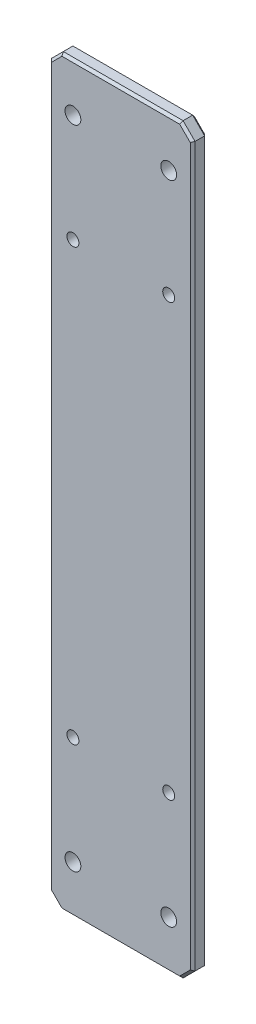
ISO-10303-21;
HEADER;
FILE_DESCRIPTION(('STEP AP214'),'2;1');
FILE_NAME('part.step','',(''),(''),'','','');
FILE_SCHEMA(('AUTOMOTIVE_DESIGN { 1 0 10303 214 1 1 1 1 }'));
ENDSEC;
DATA;
#1=APPLICATION_CONTEXT('core data for automotive mechanical design processes');
#2=APPLICATION_PROTOCOL_DEFINITION('international standard','automotive_design',2000,#1);
#3=PRODUCT_CONTEXT('',#1,'mechanical');
#4=PRODUCT('Part','Part','',(#3));
#5=PRODUCT_RELATED_PRODUCT_CATEGORY('part','',(#4));
#6=PRODUCT_DEFINITION_FORMATION('','',#4);
#7=PRODUCT_DEFINITION_CONTEXT('part definition',#1,'design');
#8=PRODUCT_DEFINITION('design','',#6,#7);
#9=PRODUCT_DEFINITION_SHAPE('','',#8);
#10=(LENGTH_UNIT() NAMED_UNIT(*) SI_UNIT(.MILLI.,.METRE.));
#11=(NAMED_UNIT(*) PLANE_ANGLE_UNIT() SI_UNIT($,.RADIAN.));
#12=(NAMED_UNIT(*) SI_UNIT($,.STERADIAN.) SOLID_ANGLE_UNIT());
#13=UNCERTAINTY_MEASURE_WITH_UNIT(LENGTH_MEASURE(1.E-05),#10,'distance_accuracy_value','');
#14=(GEOMETRIC_REPRESENTATION_CONTEXT(3) GLOBAL_UNCERTAINTY_ASSIGNED_CONTEXT((#13)) GLOBAL_UNIT_ASSIGNED_CONTEXT((#10,
#11,#12)) REPRESENTATION_CONTEXT('',''));
#15=CARTESIAN_POINT('',(0.,0.,0.));
#16=DIRECTION('',(0.,0.,1.));
#17=DIRECTION('',(1.,0.,0.));
#18=AXIS2_PLACEMENT_3D('',#15,#16,#17);
#19=CARTESIAN_POINT('',(30.,155.,6.));
#20=DIRECTION('',(-1.,0.,0.));
#21=DIRECTION('',(0.,-1.,0.));
#22=AXIS2_PLACEMENT_3D('',#19,#20,#21);
#23=PLANE('',#22);
#24=DIRECTION('',(0.,0.,1.));
#25=VECTOR('',#24,1.);
#26=CARTESIAN_POINT('',(30.,150.,6.));
#27=LINE('',#26,#25);
#28=CARTESIAN_POINT('',(30.,150.,1.));
#29=VERTEX_POINT('',#28);
#30=CARTESIAN_POINT('',(30.,150.,5.));
#31=VERTEX_POINT('',#30);
#32=EDGE_CURVE('E368',#29,#31,#27,.T.);
#33=ORIENTED_EDGE('',*,*,#32,.T.);
#34=DIRECTION('',(0.,-1.,0.));
#35=VECTOR('',#34,1.);
#36=CARTESIAN_POINT('',(30.,-150.,5.));
#37=LINE('',#36,#35);
#38=CARTESIAN_POINT('',(30.,-150.,5.));
#39=VERTEX_POINT('',#38);
#40=EDGE_CURVE('E262',#31,#39,#37,.T.);
#41=ORIENTED_EDGE('',*,*,#40,.T.);
#42=DIRECTION('',(0.,0.,-1.));
#43=VECTOR('',#42,1.);
#44=CARTESIAN_POINT('',(30.,-150.,6.));
#45=LINE('',#44,#43);
#46=CARTESIAN_POINT('',(30.,-150.,1.));
#47=VERTEX_POINT('',#46);
#48=EDGE_CURVE('E378',#39,#47,#45,.T.);
#49=ORIENTED_EDGE('',*,*,#48,.T.);
#50=DIRECTION('',(0.,1.,0.));
#51=VECTOR('',#50,1.);
#52=CARTESIAN_POINT('',(30.,155.,1.));
#53=LINE('',#52,#51);
#54=EDGE_CURVE('E259',#47,#29,#53,.T.);
#55=ORIENTED_EDGE('',*,*,#54,.T.);
#56=EDGE_LOOP('',(#33,#41,#49,#55));
#57=FACE_BOUND('',#56,.T.);
#58=ADVANCED_FACE('F44',(#57),#23,.F.);
#59=CARTESIAN_POINT('',(-30.,155.,6.));
#60=DIRECTION('',(0.,-1.,0.));
#61=DIRECTION('',(0.,0.,-1.));
#62=AXIS2_PLACEMENT_3D('',#59,#60,#61);
#63=PLANE('',#62);
#64=DIRECTION('',(0.,0.,1.));
#65=VECTOR('',#64,1.);
#66=CARTESIAN_POINT('',(-25.,155.,6.));
#67=LINE('',#66,#65);
#68=CARTESIAN_POINT('',(-25.,155.,1.));
#69=VERTEX_POINT('',#68);
#70=CARTESIAN_POINT('',(-25.,155.,4.99999999999999));
#71=VERTEX_POINT('',#70);
#72=EDGE_CURVE('E190',#69,#71,#67,.T.);
#73=ORIENTED_EDGE('',*,*,#72,.T.);
#74=DIRECTION('',(1.,0.,0.));
#75=VECTOR('',#74,1.);
#76=CARTESIAN_POINT('',(25.,155.,5.));
#77=LINE('',#76,#75);
#78=CARTESIAN_POINT('',(25.,155.,5.));
#79=VERTEX_POINT('',#78);
#80=EDGE_CURVE('E226',#71,#79,#77,.T.);
#81=ORIENTED_EDGE('',*,*,#80,.T.);
#82=DIRECTION('',(0.,0.,-1.));
#83=VECTOR('',#82,1.);
#84=CARTESIAN_POINT('',(25.,155.,6.));
#85=LINE('',#84,#83);
#86=CARTESIAN_POINT('',(25.,155.,1.00000000000001));
#87=VERTEX_POINT('',#86);
#88=EDGE_CURVE('E195',#79,#87,#85,.T.);
#89=ORIENTED_EDGE('',*,*,#88,.T.);
#90=DIRECTION('',(-1.,0.,0.));
#91=VECTOR('',#90,1.);
#92=CARTESIAN_POINT('',(-30.,155.,1.));
#93=LINE('',#92,#91);
#94=EDGE_CURVE('E223',#87,#69,#93,.T.);
#95=ORIENTED_EDGE('',*,*,#94,.T.);
#96=EDGE_LOOP('',(#73,#81,#89,#95));
#97=FACE_BOUND('',#96,.T.);
#98=ADVANCED_FACE('F386',(#97),#63,.F.);
#99=CARTESIAN_POINT('',(-30.,155.,6.));
#100=DIRECTION('',(1.,0.,0.));
#101=DIRECTION('',(0.,1.,0.));
#102=AXIS2_PLACEMENT_3D('',#99,#100,#101);
#103=PLANE('',#102);
#104=DIRECTION('',(0.,0.,1.));
#105=VECTOR('',#104,1.);
#106=CARTESIAN_POINT('',(-30.,-150.,6.));
#107=LINE('',#106,#105);
#108=CARTESIAN_POINT('',(-30.,-150.,1.));
#109=VERTEX_POINT('',#108);
#110=CARTESIAN_POINT('',(-30.,-150.,5.00000000000001));
#111=VERTEX_POINT('',#110);
#112=EDGE_CURVE('E362',#109,#111,#107,.T.);
#113=ORIENTED_EDGE('',*,*,#112,.T.);
#114=DIRECTION('',(0.,1.,0.));
#115=VECTOR('',#114,1.);
#116=CARTESIAN_POINT('',(-30.,150.,5.));
#117=LINE('',#116,#115);
#118=CARTESIAN_POINT('',(-30.,150.,5.));
#119=VERTEX_POINT('',#118);
#120=EDGE_CURVE('E238',#111,#119,#117,.T.);
#121=ORIENTED_EDGE('',*,*,#120,.T.);
#122=DIRECTION('',(0.,0.,-1.));
#123=VECTOR('',#122,1.);
#124=CARTESIAN_POINT('',(-30.,150.,6.));
#125=LINE('',#124,#123);
#126=CARTESIAN_POINT('',(-30.,150.,1.));
#127=VERTEX_POINT('',#126);
#128=EDGE_CURVE('E354',#119,#127,#125,.T.);
#129=ORIENTED_EDGE('',*,*,#128,.T.);
#130=DIRECTION('',(0.,-1.,0.));
#131=VECTOR('',#130,1.);
#132=CARTESIAN_POINT('',(-30.,155.,1.));
#133=LINE('',#132,#131);
#134=EDGE_CURVE('E235',#127,#109,#133,.T.);
#135=ORIENTED_EDGE('',*,*,#134,.T.);
#136=EDGE_LOOP('',(#113,#121,#129,#135));
#137=FACE_BOUND('',#136,.T.);
#138=ADVANCED_FACE('F358',(#137),#103,.F.);
#139=CARTESIAN_POINT('',(-30.,-155.,6.));
#140=DIRECTION('',(0.,1.,0.));
#141=DIRECTION('',(0.,0.,1.));
#142=AXIS2_PLACEMENT_3D('',#139,#140,#141);
#143=PLANE('',#142);
#144=DIRECTION('',(0.,0.,1.));
#145=VECTOR('',#144,1.);
#146=CARTESIAN_POINT('',(25.,-155.,6.));
#147=LINE('',#146,#145);
#148=CARTESIAN_POINT('',(25.,-155.,1.));
#149=VERTEX_POINT('',#148);
#150=CARTESIAN_POINT('',(25.,-155.,5.));
#151=VERTEX_POINT('',#150);
#152=EDGE_CURVE('E371',#149,#151,#147,.T.);
#153=ORIENTED_EDGE('',*,*,#152,.T.);
#154=DIRECTION('',(-1.,0.,0.));
#155=VECTOR('',#154,1.);
#156=CARTESIAN_POINT('',(-25.,-155.,5.));
#157=LINE('',#156,#155);
#158=CARTESIAN_POINT('',(-25.,-155.,5.));
#159=VERTEX_POINT('',#158);
#160=EDGE_CURVE('E250',#151,#159,#157,.T.);
#161=ORIENTED_EDGE('',*,*,#160,.T.);
#162=DIRECTION('',(0.,0.,-1.));
#163=VECTOR('',#162,1.);
#164=CARTESIAN_POINT('',(-25.,-155.,6.));
#165=LINE('',#164,#163);
#166=CARTESIAN_POINT('',(-25.,-155.,0.999999999999997));
#167=VERTEX_POINT('',#166);
#168=EDGE_CURVE('E363',#159,#167,#165,.T.);
#169=ORIENTED_EDGE('',*,*,#168,.T.);
#170=DIRECTION('',(1.,0.,0.));
#171=VECTOR('',#170,1.);
#172=CARTESIAN_POINT('',(-30.,-155.,1.));
#173=LINE('',#172,#171);
#174=EDGE_CURVE('E247',#167,#149,#173,.T.);
#175=ORIENTED_EDGE('',*,*,#174,.T.);
#176=EDGE_LOOP('',(#153,#161,#169,#175));
#177=FACE_BOUND('',#176,.T.);
#178=ADVANCED_FACE('F419',(#177),#143,.F.);
#179=CARTESIAN_POINT('',(0.,0.,6.));
#180=DIRECTION('',(0.,0.,1.));
#181=DIRECTION('',(1.,0.,0.));
#182=AXIS2_PLACEMENT_3D('',#179,#180,#181);
#183=PLANE('',#182);
#184=CARTESIAN_POINT('',(20.,89.9999998886689,6.));
#185=DIRECTION('',(0.,0.,1.));
#186=DIRECTION('',(1.,0.,0.));
#187=AXIS2_PLACEMENT_3D('',#184,#185,#186);
#188=CIRCLE('',#187,2.5);
#189=CARTESIAN_POINT('',(22.5,89.9999998886689,6.));
#190=VERTEX_POINT('',#189);
#191=EDGE_CURVE('E887',#190,#190,#188,.T.);
#192=ORIENTED_EDGE('',*,*,#191,.F.);
#193=EDGE_LOOP('',(#192));
#194=FACE_BOUND('',#193,.T.);
#195=CARTESIAN_POINT('',(-20.,89.9999998886689,6.));
#196=DIRECTION('',(0.,0.,1.));
#197=DIRECTION('',(1.,0.,0.));
#198=AXIS2_PLACEMENT_3D('',#195,#196,#197);
#199=CIRCLE('',#198,2.5);
#200=CARTESIAN_POINT('',(-17.5,89.9999998886689,6.));
#201=VERTEX_POINT('',#200);
#202=EDGE_CURVE('E891',#201,#201,#199,.T.);
#203=ORIENTED_EDGE('',*,*,#202,.F.);
#204=EDGE_LOOP('',(#203));
#205=FACE_BOUND('',#204,.T.);
#206=CARTESIAN_POINT('',(-20.,-90.0000001113311,6.));
#207=DIRECTION('',(0.,0.,1.));
#208=DIRECTION('',(1.,0.,0.));
#209=AXIS2_PLACEMENT_3D('',#206,#207,#208);
#210=CIRCLE('',#209,2.5);
#211=CARTESIAN_POINT('',(-17.5,-90.0000001113311,6.));
#212=VERTEX_POINT('',#211);
#213=EDGE_CURVE('E895',#212,#212,#210,.T.);
#214=ORIENTED_EDGE('',*,*,#213,.F.);
#215=EDGE_LOOP('',(#214));
#216=FACE_BOUND('',#215,.T.);
#217=CARTESIAN_POINT('',(20.,-90.0000001113311,6.));
#218=DIRECTION('',(0.,0.,1.));
#219=DIRECTION('',(1.,0.,0.));
#220=AXIS2_PLACEMENT_3D('',#217,#218,#219);
#221=CIRCLE('',#220,2.5);
#222=CARTESIAN_POINT('',(22.5,-90.0000001113311,6.));
#223=VERTEX_POINT('',#222);
#224=EDGE_CURVE('E311',#223,#223,#221,.T.);
#225=ORIENTED_EDGE('',*,*,#224,.F.);
#226=EDGE_LOOP('',(#225));
#227=FACE_BOUND('',#226,.T.);
#228=DIRECTION('',(0.,1.,0.));
#229=VECTOR('',#228,1.);
#230=CARTESIAN_POINT('',(29.,150.,6.));
#231=LINE('',#230,#229);
#232=CARTESIAN_POINT('',(29.,-149.585786437627,6.));
#233=VERTEX_POINT('',#232);
#234=CARTESIAN_POINT('',(29.,149.585786437627,6.));
#235=VERTEX_POINT('',#234);
#236=EDGE_CURVE('E166',#233,#235,#231,.T.);
#237=ORIENTED_EDGE('',*,*,#236,.T.);
#238=DIRECTION('',(-0.707106781186546,0.707106781186549,0.));
#239=VECTOR('',#238,1.);
#240=CARTESIAN_POINT('',(89.2928932188135,89.292893218813,6.));
#241=LINE('',#240,#239);
#242=CARTESIAN_POINT('',(24.5857864376269,154.,6.));
#243=VERTEX_POINT('',#242);
#244=EDGE_CURVE('E213',#235,#243,#241,.T.);
#245=ORIENTED_EDGE('',*,*,#244,.T.);
#246=DIRECTION('',(-1.,0.,0.));
#247=VECTOR('',#246,1.);
#248=CARTESIAN_POINT('',(-25.,154.,6.));
#249=LINE('',#248,#247);
#250=CARTESIAN_POINT('',(-24.5857864376269,154.,6.));
#251=VERTEX_POINT('',#250);
#252=EDGE_CURVE('E210',#243,#251,#249,.T.);
#253=ORIENTED_EDGE('',*,*,#252,.T.);
#254=DIRECTION('',(-0.707106781186551,-0.707106781186544,0.));
#255=VECTOR('',#254,1.);
#256=CARTESIAN_POINT('',(-89.2928932188133,89.2928932188143,6.));
#257=LINE('',#256,#255);
#258=CARTESIAN_POINT('',(-29.,149.585786437627,6.));
#259=VERTEX_POINT('',#258);
#260=EDGE_CURVE('E207',#251,#259,#257,.T.);
#261=ORIENTED_EDGE('',*,*,#260,.T.);
#262=DIRECTION('',(0.,-1.,0.));
#263=VECTOR('',#262,1.);
#264=CARTESIAN_POINT('',(-29.,-150.,6.));
#265=LINE('',#264,#263);
#266=CARTESIAN_POINT('',(-29.,-149.585786437627,6.));
#267=VERTEX_POINT('',#266);
#268=EDGE_CURVE('E204',#259,#267,#265,.T.);
#269=ORIENTED_EDGE('',*,*,#268,.T.);
#270=DIRECTION('',(0.707106781186544,-0.707106781186551,0.));
#271=VECTOR('',#270,1.);
#272=CARTESIAN_POINT('',(-89.2928932188136,-89.2928932188126,6.));
#273=LINE('',#272,#271);
#274=CARTESIAN_POINT('',(-24.5857864376269,-154.,6.));
#275=VERTEX_POINT('',#274);
#276=EDGE_CURVE('E201',#267,#275,#273,.T.);
#277=ORIENTED_EDGE('',*,*,#276,.T.);
#278=DIRECTION('',(1.,0.,0.));
#279=VECTOR('',#278,1.);
#280=CARTESIAN_POINT('',(25.,-154.,6.));
#281=LINE('',#280,#279);
#282=CARTESIAN_POINT('',(24.5857864376269,-154.,6.));
#283=VERTEX_POINT('',#282);
#284=EDGE_CURVE('E169',#275,#283,#281,.T.);
#285=ORIENTED_EDGE('',*,*,#284,.T.);
#286=DIRECTION('',(0.707106781186552,0.707106781186543,0.));
#287=VECTOR('',#286,1.);
#288=CARTESIAN_POINT('',(89.2928932188133,-89.2928932188144,6.));
#289=LINE('',#288,#287);
#290=EDGE_CURVE('E160',#283,#233,#289,.T.);
#291=ORIENTED_EDGE('',*,*,#290,.T.);
#292=EDGE_LOOP('',(#237,#245,#253,#261,#269,#277,#285,#291));
#293=FACE_BOUND('',#292,.T.);
#294=CARTESIAN_POINT('',(20.,135.,6.));
#295=DIRECTION('',(0.,0.,1.));
#296=DIRECTION('',(1.,0.,0.));
#297=AXIS2_PLACEMENT_3D('',#294,#295,#296);
#298=CIRCLE('',#297,3.3);
#299=CARTESIAN_POINT('',(23.3,135.,6.));
#300=VERTEX_POINT('',#299);
#301=EDGE_CURVE('E920',#300,#300,#298,.T.);
#302=ORIENTED_EDGE('',*,*,#301,.F.);
#303=EDGE_LOOP('',(#302));
#304=FACE_BOUND('',#303,.T.);
#305=CARTESIAN_POINT('',(-20.,-135.,6.));
#306=DIRECTION('',(0.,0.,1.));
#307=DIRECTION('',(1.,0.,0.));
#308=AXIS2_PLACEMENT_3D('',#305,#306,#307);
#309=CIRCLE('',#308,3.3);
#310=CARTESIAN_POINT('',(-16.7,-135.,6.));
#311=VERTEX_POINT('',#310);
#312=EDGE_CURVE('E911',#311,#311,#309,.T.);
#313=ORIENTED_EDGE('',*,*,#312,.F.);
#314=EDGE_LOOP('',(#313));
#315=FACE_BOUND('',#314,.T.);
#316=CARTESIAN_POINT('',(20.,-135.,6.));
#317=DIRECTION('',(0.,0.,1.));
#318=DIRECTION('',(1.,0.,0.));
#319=AXIS2_PLACEMENT_3D('',#316,#317,#318);
#320=CIRCLE('',#319,3.3);
#321=CARTESIAN_POINT('',(23.3,-135.,6.));
#322=VERTEX_POINT('',#321);
#323=EDGE_CURVE('E307',#322,#322,#320,.T.);
#324=ORIENTED_EDGE('',*,*,#323,.F.);
#325=EDGE_LOOP('',(#324));
#326=FACE_BOUND('',#325,.T.);
#327=CARTESIAN_POINT('',(-20.,135.,6.));
#328=DIRECTION('',(0.,0.,1.));
#329=DIRECTION('',(1.,0.,0.));
#330=AXIS2_PLACEMENT_3D('',#327,#328,#329);
#331=CIRCLE('',#330,3.3);
#332=CARTESIAN_POINT('',(-16.7,135.,6.));
#333=VERTEX_POINT('',#332);
#334=EDGE_CURVE('E919',#333,#333,#331,.T.);
#335=ORIENTED_EDGE('',*,*,#334,.F.);
#336=EDGE_LOOP('',(#335));
#337=FACE_BOUND('',#336,.T.);
#338=ADVANCED_FACE('F162',(#194,#205,#216,#227,#293,#304,#315,#326,#337),#183,.T.);
#339=CARTESIAN_POINT('',(0.,0.,0.));
#340=DIRECTION('',(0.,0.,1.));
#341=DIRECTION('',(1.,0.,0.));
#342=AXIS2_PLACEMENT_3D('',#339,#340,#341);
#343=PLANE('',#342);
#344=CARTESIAN_POINT('',(20.,89.9999998886689,0.));
#345=DIRECTION('',(0.,0.,-1.));
#346=DIRECTION('',(-1.,0.,0.));
#347=AXIS2_PLACEMENT_3D('',#344,#345,#346);
#348=CIRCLE('',#347,2.5);
#349=CARTESIAN_POINT('',(17.5,89.9999998886689,0.));
#350=VERTEX_POINT('',#349);
#351=EDGE_CURVE('E986',#350,#350,#348,.T.);
#352=ORIENTED_EDGE('',*,*,#351,.F.);
#353=EDGE_LOOP('',(#352));
#354=FACE_BOUND('',#353,.T.);
#355=CARTESIAN_POINT('',(-20.,89.9999998886689,0.));
#356=DIRECTION('',(0.,0.,-1.));
#357=DIRECTION('',(-1.,0.,0.));
#358=AXIS2_PLACEMENT_3D('',#355,#356,#357);
#359=CIRCLE('',#358,2.5);
#360=CARTESIAN_POINT('',(-22.5,89.9999998886689,0.));
#361=VERTEX_POINT('',#360);
#362=EDGE_CURVE('E980',#361,#361,#359,.T.);
#363=ORIENTED_EDGE('',*,*,#362,.F.);
#364=EDGE_LOOP('',(#363));
#365=FACE_BOUND('',#364,.T.);
#366=CARTESIAN_POINT('',(-20.,-90.0000001113311,0.));
#367=DIRECTION('',(0.,0.,-1.));
#368=DIRECTION('',(-1.,0.,0.));
#369=AXIS2_PLACEMENT_3D('',#366,#367,#368);
#370=CIRCLE('',#369,2.5);
#371=CARTESIAN_POINT('',(-22.5,-90.0000001113311,0.));
#372=VERTEX_POINT('',#371);
#373=EDGE_CURVE('E974',#372,#372,#370,.T.);
#374=ORIENTED_EDGE('',*,*,#373,.F.);
#375=EDGE_LOOP('',(#374));
#376=FACE_BOUND('',#375,.T.);
#377=CARTESIAN_POINT('',(20.,-90.0000001113311,0.));
#378=DIRECTION('',(0.,0.,-1.));
#379=DIRECTION('',(-1.,0.,0.));
#380=AXIS2_PLACEMENT_3D('',#377,#378,#379);
#381=CIRCLE('',#380,2.5);
#382=CARTESIAN_POINT('',(17.5,-90.0000001113311,0.));
#383=VERTEX_POINT('',#382);
#384=EDGE_CURVE('E899',#383,#383,#381,.T.);
#385=ORIENTED_EDGE('',*,*,#384,.F.);
#386=EDGE_LOOP('',(#385));
#387=FACE_BOUND('',#386,.T.);
#388=DIRECTION('',(0.,-1.,0.));
#389=VECTOR('',#388,1.);
#390=CARTESIAN_POINT('',(29.,0.,0.));
#391=LINE('',#390,#389);
#392=CARTESIAN_POINT('',(29.,149.585786437627,0.));
#393=VERTEX_POINT('',#392);
#394=CARTESIAN_POINT('',(29.,-149.585786437627,0.));
#395=VERTEX_POINT('',#394);
#396=EDGE_CURVE('E265',#393,#395,#391,.T.);
#397=ORIENTED_EDGE('',*,*,#396,.T.);
#398=DIRECTION('',(-0.707106781186552,-0.707106781186543,0.));
#399=VECTOR('',#398,1.);
#400=CARTESIAN_POINT('',(24.2928932188135,-154.292893218813,0.));
#401=LINE('',#400,#399);
#402=CARTESIAN_POINT('',(24.5857864376269,-154.,0.));
#403=VERTEX_POINT('',#402);
#404=EDGE_CURVE('E11',#395,#403,#401,.T.);
#405=ORIENTED_EDGE('',*,*,#404,.T.);
#406=DIRECTION('',(-1.,0.,0.));
#407=VECTOR('',#406,1.);
#408=CARTESIAN_POINT('',(0.,-154.,0.));
#409=LINE('',#408,#407);
#410=CARTESIAN_POINT('',(-24.5857864376269,-154.,0.));
#411=VERTEX_POINT('',#410);
#412=EDGE_CURVE('E55',#403,#411,#409,.T.);
#413=ORIENTED_EDGE('',*,*,#412,.T.);
#414=DIRECTION('',(-0.707106781186544,0.707106781186551,0.));
#415=VECTOR('',#414,1.);
#416=CARTESIAN_POINT('',(-29.2928932188134,-149.292893218813,0.));
#417=LINE('',#416,#415);
#418=CARTESIAN_POINT('',(-29.,-149.585786437627,0.));
#419=VERTEX_POINT('',#418);
#420=EDGE_CURVE('E280',#411,#419,#417,.T.);
#421=ORIENTED_EDGE('',*,*,#420,.T.);
#422=DIRECTION('',(0.,1.,0.));
#423=VECTOR('',#422,1.);
#424=CARTESIAN_POINT('',(-29.,0.,0.));
#425=LINE('',#424,#423);
#426=CARTESIAN_POINT('',(-29.,149.585786437627,0.));
#427=VERTEX_POINT('',#426);
#428=EDGE_CURVE('E277',#419,#427,#425,.T.);
#429=ORIENTED_EDGE('',*,*,#428,.T.);
#430=DIRECTION('',(0.707106781186551,0.707106781186544,0.));
#431=VECTOR('',#430,1.);
#432=CARTESIAN_POINT('',(-24.2928932188135,154.292893218813,0.));
#433=LINE('',#432,#431);
#434=CARTESIAN_POINT('',(-24.5857864376269,154.,0.));
#435=VERTEX_POINT('',#434);
#436=EDGE_CURVE('E274',#427,#435,#433,.T.);
#437=ORIENTED_EDGE('',*,*,#436,.T.);
#438=DIRECTION('',(1.,0.,0.));
#439=VECTOR('',#438,1.);
#440=CARTESIAN_POINT('',(0.,154.,0.));
#441=LINE('',#440,#439);
#442=CARTESIAN_POINT('',(24.5857864376269,154.,0.));
#443=VERTEX_POINT('',#442);
#444=EDGE_CURVE('E271',#435,#443,#441,.T.);
#445=ORIENTED_EDGE('',*,*,#444,.T.);
#446=DIRECTION('',(0.707106781186546,-0.707106781186549,0.));
#447=VECTOR('',#446,1.);
#448=CARTESIAN_POINT('',(29.2928932188135,149.292893218813,0.));
#449=LINE('',#448,#447);
#450=EDGE_CURVE('E268',#443,#393,#449,.T.);
#451=ORIENTED_EDGE('',*,*,#450,.T.);
#452=EDGE_LOOP('',(#397,#405,#413,#421,#429,#437,#445,#451));
#453=FACE_BOUND('',#452,.T.);
#454=CARTESIAN_POINT('',(20.,135.,0.));
#455=DIRECTION('',(0.,0.,1.));
#456=DIRECTION('',(1.,0.,0.));
#457=AXIS2_PLACEMENT_3D('',#454,#455,#456);
#458=CIRCLE('',#457,3.3);
#459=CARTESIAN_POINT('',(23.3,135.,0.));
#460=VERTEX_POINT('',#459);
#461=EDGE_CURVE('E915',#460,#460,#458,.T.);
#462=ORIENTED_EDGE('',*,*,#461,.T.);
#463=EDGE_LOOP('',(#462));
#464=FACE_BOUND('',#463,.T.);
#465=CARTESIAN_POINT('',(-20.,-135.,0.));
#466=DIRECTION('',(0.,0.,1.));
#467=DIRECTION('',(1.,0.,0.));
#468=AXIS2_PLACEMENT_3D('',#465,#466,#467);
#469=CIRCLE('',#468,3.3);
#470=CARTESIAN_POINT('',(-16.7,-135.,0.));
#471=VERTEX_POINT('',#470);
#472=EDGE_CURVE('E924',#471,#471,#469,.T.);
#473=ORIENTED_EDGE('',*,*,#472,.T.);
#474=EDGE_LOOP('',(#473));
#475=FACE_BOUND('',#474,.T.);
#476=CARTESIAN_POINT('',(20.,-135.,0.));
#477=DIRECTION('',(0.,0.,1.));
#478=DIRECTION('',(1.,0.,0.));
#479=AXIS2_PLACEMENT_3D('',#476,#477,#478);
#480=CIRCLE('',#479,3.3);
#481=CARTESIAN_POINT('',(23.3,-135.,0.));
#482=VERTEX_POINT('',#481);
#483=EDGE_CURVE('E907',#482,#482,#480,.T.);
#484=ORIENTED_EDGE('',*,*,#483,.T.);
#485=EDGE_LOOP('',(#484));
#486=FACE_BOUND('',#485,.T.);
#487=CARTESIAN_POINT('',(-20.,135.,0.));
#488=DIRECTION('',(0.,0.,1.));
#489=DIRECTION('',(1.,0.,0.));
#490=AXIS2_PLACEMENT_3D('',#487,#488,#489);
#491=CIRCLE('',#490,3.3);
#492=CARTESIAN_POINT('',(-16.7,135.,0.));
#493=VERTEX_POINT('',#492);
#494=EDGE_CURVE('E435',#493,#493,#491,.T.);
#495=ORIENTED_EDGE('',*,*,#494,.T.);
#496=EDGE_LOOP('',(#495));
#497=FACE_BOUND('',#496,.T.);
#498=ADVANCED_FACE('F447',(#354,#365,#376,#387,#453,#464,#475,#486,#497),#343,.F.);
#499=CARTESIAN_POINT('',(-20.,135.,0.));
#500=DIRECTION('',(0.,0.,1.));
#501=DIRECTION('',(1.,0.,0.));
#502=AXIS2_PLACEMENT_3D('',#499,#500,#501);
#503=CYLINDRICAL_SURFACE('',#502,3.3);
#504=ORIENTED_EDGE('',*,*,#494,.F.);
#505=EDGE_LOOP('',(#504));
#506=FACE_BOUND('',#505,.T.);
#507=ORIENTED_EDGE('',*,*,#334,.T.);
#508=EDGE_LOOP('',(#507));
#509=FACE_BOUND('',#508,.T.);
#510=ADVANCED_FACE('F635',(#506,#509),#503,.F.);
#511=CARTESIAN_POINT('',(20.,-135.,0.));
#512=DIRECTION('',(0.,0.,1.));
#513=DIRECTION('',(1.,0.,0.));
#514=AXIS2_PLACEMENT_3D('',#511,#512,#513);
#515=CYLINDRICAL_SURFACE('',#514,3.3);
#516=ORIENTED_EDGE('',*,*,#483,.F.);
#517=EDGE_LOOP('',(#516));
#518=FACE_BOUND('',#517,.T.);
#519=ORIENTED_EDGE('',*,*,#323,.T.);
#520=EDGE_LOOP('',(#519));
#521=FACE_BOUND('',#520,.T.);
#522=ADVANCED_FACE('F660',(#518,#521),#515,.F.);
#523=CARTESIAN_POINT('',(-20.,-135.,0.));
#524=DIRECTION('',(0.,0.,1.));
#525=DIRECTION('',(1.,0.,0.));
#526=AXIS2_PLACEMENT_3D('',#523,#524,#525);
#527=CYLINDRICAL_SURFACE('',#526,3.3);
#528=ORIENTED_EDGE('',*,*,#472,.F.);
#529=EDGE_LOOP('',(#528));
#530=FACE_BOUND('',#529,.T.);
#531=ORIENTED_EDGE('',*,*,#312,.T.);
#532=EDGE_LOOP('',(#531));
#533=FACE_BOUND('',#532,.T.);
#534=ADVANCED_FACE('F670',(#530,#533),#527,.F.);
#535=CARTESIAN_POINT('',(20.,135.,0.));
#536=DIRECTION('',(0.,0.,1.));
#537=DIRECTION('',(1.,0.,0.));
#538=AXIS2_PLACEMENT_3D('',#535,#536,#537);
#539=CYLINDRICAL_SURFACE('',#538,3.3);
#540=ORIENTED_EDGE('',*,*,#461,.F.);
#541=EDGE_LOOP('',(#540));
#542=FACE_BOUND('',#541,.T.);
#543=ORIENTED_EDGE('',*,*,#301,.T.);
#544=EDGE_LOOP('',(#543));
#545=FACE_BOUND('',#544,.T.);
#546=ADVANCED_FACE('F472',(#542,#545),#539,.F.);
#547=CARTESIAN_POINT('',(-25.,-155.,6.));
#548=DIRECTION('',(0.707106781186551,0.707106781186543,0.));
#549=DIRECTION('',(0.,0.,-1.));
#550=AXIS2_PLACEMENT_3D('',#547,#548,#549);
#551=PLANE('',#550);
#552=ORIENTED_EDGE('',*,*,#168,.F.);
#553=DIRECTION('',(0.707106781186544,-0.707106781186551,0.));
#554=VECTOR('',#553,1.);
#555=CARTESIAN_POINT('',(-25.,-155.,5.00000000000001));
#556=LINE('',#555,#554);
#557=EDGE_CURVE('E244',#159,#111,#556,.F.);
#558=ORIENTED_EDGE('',*,*,#557,.T.);
#559=ORIENTED_EDGE('',*,*,#112,.F.);
#560=DIRECTION('',(-0.707106781186544,0.707106781186551,0.));
#561=VECTOR('',#560,1.);
#562=CARTESIAN_POINT('',(-25.,-155.,0.999999999999997));
#563=LINE('',#562,#561);
#564=EDGE_CURVE('E241',#109,#167,#563,.F.);
#565=ORIENTED_EDGE('',*,*,#564,.T.);
#566=EDGE_LOOP('',(#552,#558,#559,#565));
#567=FACE_BOUND('',#566,.T.);
#568=ADVANCED_FACE('F423',(#567),#551,.F.);
#569=CARTESIAN_POINT('',(30.,-150.,6.));
#570=DIRECTION('',(-0.707106781186543,0.707106781186552,0.));
#571=DIRECTION('',(0.,0.,-1.));
#572=AXIS2_PLACEMENT_3D('',#569,#570,#571);
#573=PLANE('',#572);
#574=ORIENTED_EDGE('',*,*,#48,.F.);
#575=DIRECTION('',(0.707106781186552,0.707106781186543,0.));
#576=VECTOR('',#575,1.);
#577=CARTESIAN_POINT('',(30.,-150.,5.));
#578=LINE('',#577,#576);
#579=EDGE_CURVE('E179',#39,#151,#578,.F.);
#580=ORIENTED_EDGE('',*,*,#579,.T.);
#581=ORIENTED_EDGE('',*,*,#152,.F.);
#582=DIRECTION('',(-0.707106781186552,-0.707106781186543,0.));
#583=VECTOR('',#582,1.);
#584=CARTESIAN_POINT('',(30.,-150.,1.00000000000001));
#585=LINE('',#584,#583);
#586=EDGE_CURVE('E253',#149,#47,#585,.F.);
#587=ORIENTED_EDGE('',*,*,#586,.T.);
#588=EDGE_LOOP('',(#574,#580,#581,#587));
#589=FACE_BOUND('',#588,.T.);
#590=ADVANCED_FACE('F433',(#589),#573,.F.);
#591=CARTESIAN_POINT('',(-30.,150.,6.));
#592=DIRECTION('',(0.707106781186544,-0.707106781186551,0.));
#593=DIRECTION('',(0.,0.,-1.));
#594=AXIS2_PLACEMENT_3D('',#591,#592,#593);
#595=PLANE('',#594);
#596=ORIENTED_EDGE('',*,*,#128,.F.);
#597=DIRECTION('',(-0.707106781186551,-0.707106781186544,0.));
#598=VECTOR('',#597,1.);
#599=CARTESIAN_POINT('',(-30.,150.,4.99999999999999));
#600=LINE('',#599,#598);
#601=EDGE_CURVE('E232',#119,#71,#600,.F.);
#602=ORIENTED_EDGE('',*,*,#601,.T.);
#603=ORIENTED_EDGE('',*,*,#72,.F.);
#604=DIRECTION('',(0.707106781186551,0.707106781186544,0.));
#605=VECTOR('',#604,1.);
#606=CARTESIAN_POINT('',(-30.,150.,1.));
#607=LINE('',#606,#605);
#608=EDGE_CURVE('E229',#69,#127,#607,.F.);
#609=ORIENTED_EDGE('',*,*,#608,.T.);
#610=EDGE_LOOP('',(#596,#602,#603,#609));
#611=FACE_BOUND('',#610,.T.);
#612=ADVANCED_FACE('F353',(#611),#595,.F.);
#613=CARTESIAN_POINT('',(25.,155.,6.));
#614=DIRECTION('',(-0.707106781186549,-0.707106781186545,0.));
#615=DIRECTION('',(0.,0.,-1.));
#616=AXIS2_PLACEMENT_3D('',#613,#614,#615);
#617=PLANE('',#616);
#618=ORIENTED_EDGE('',*,*,#88,.F.);
#619=DIRECTION('',(-0.707106781186546,0.707106781186549,0.));
#620=VECTOR('',#619,1.);
#621=CARTESIAN_POINT('',(25.,155.,5.));
#622=LINE('',#621,#620);
#623=EDGE_CURVE('E219',#79,#31,#622,.F.);
#624=ORIENTED_EDGE('',*,*,#623,.T.);
#625=ORIENTED_EDGE('',*,*,#32,.F.);
#626=DIRECTION('',(0.707106781186546,-0.707106781186549,0.));
#627=VECTOR('',#626,1.);
#628=CARTESIAN_POINT('',(25.,155.,1.00000000000001));
#629=LINE('',#628,#627);
#630=EDGE_CURVE('E216',#29,#87,#629,.F.);
#631=ORIENTED_EDGE('',*,*,#630,.T.);
#632=EDGE_LOOP('',(#618,#624,#625,#631));
#633=FACE_BOUND('',#632,.T.);
#634=ADVANCED_FACE('F390',(#633),#617,.F.);
#635=CARTESIAN_POINT('',(-89.2928932188136,-89.2928932188126,6.));
#636=DIRECTION('',(-0.500000000000008,-0.500000000000002,0.70710678118654));
#637=DIRECTION('',(-0.707106781186544,0.707106781186551,0.));
#638=AXIS2_PLACEMENT_3D('',#635,#636,#637);
#639=PLANE('',#638);
#640=DIRECTION('',(-0.678598344545852,-0.281084637714799,-0.678598344545851));
#641=VECTOR('',#640,1.);
#642=CARTESIAN_POINT('',(-45.2641371769495,-156.322612636615,-10.2641371769494));
#643=LINE('',#642,#641);
#644=EDGE_CURVE('E299',#111,#267,#643,.F.);
#645=ORIENTED_EDGE('',*,*,#644,.F.);
#646=ORIENTED_EDGE('',*,*,#557,.F.);
#647=DIRECTION('',(-0.281084637714804,-0.67859834454585,-0.67859834454585));
#648=VECTOR('',#647,1.);
#649=CARTESIAN_POINT('',(-22.6432985213573,-149.310419327796,10.6895806722041));
#650=LINE('',#649,#648);
#651=EDGE_CURVE('E303',#275,#159,#650,.T.);
#652=ORIENTED_EDGE('',*,*,#651,.F.);
#653=ORIENTED_EDGE('',*,*,#276,.F.);
#654=EDGE_LOOP('',(#645,#646,#652,#653));
#655=FACE_BOUND('',#654,.T.);
#656=ADVANCED_FACE('F411',(#655),#639,.T.);
#657=CARTESIAN_POINT('',(0.,-154.,6.));
#658=DIRECTION('',(0.,-0.707106781186547,0.707106781186547));
#659=DIRECTION('',(-1.,0.,0.));
#660=AXIS2_PLACEMENT_3D('',#657,#658,#659);
#661=PLANE('',#660);
#662=ORIENTED_EDGE('',*,*,#651,.T.);
#663=ORIENTED_EDGE('',*,*,#160,.F.);
#664=DIRECTION('',(0.281084637714799,-0.678598344545851,-0.678598344545851));
#665=VECTOR('',#664,1.);
#666=CARTESIAN_POINT('',(17.3557381027063,-136.54511925322,23.4548807467797));
#667=LINE('',#666,#665);
#668=EDGE_CURVE('E296',#283,#151,#667,.T.);
#669=ORIENTED_EDGE('',*,*,#668,.F.);
#670=ORIENTED_EDGE('',*,*,#284,.F.);
#671=EDGE_LOOP('',(#662,#663,#669,#670));
#672=FACE_BOUND('',#671,.T.);
#673=ADVANCED_FACE('F415',(#672),#661,.T.);
#674=CARTESIAN_POINT('',(-29.,0.,6.));
#675=DIRECTION('',(-0.707106781186547,0.,0.707106781186548));
#676=DIRECTION('',(0.,1.,0.));
#677=AXIS2_PLACEMENT_3D('',#674,#675,#676);
#678=PLANE('',#677);
#679=ORIENTED_EDGE('',*,*,#644,.T.);
#680=ORIENTED_EDGE('',*,*,#268,.F.);
#681=DIRECTION('',(-0.678598344545849,0.281084637714815,-0.678598344545848));
#682=VECTOR('',#681,1.);
#683=CARTESIAN_POINT('',(-0.467473098977815,137.767226826449,34.5325269010222));
#684=LINE('',#683,#682);
#685=EDGE_CURVE('E183',#119,#259,#684,.F.);
#686=ORIENTED_EDGE('',*,*,#685,.F.);
#687=ORIENTED_EDGE('',*,*,#120,.F.);
#688=EDGE_LOOP('',(#679,#680,#686,#687));
#689=FACE_BOUND('',#688,.T.);
#690=ADVANCED_FACE('F406',(#689),#678,.T.);
#691=CARTESIAN_POINT('',(89.2928932188133,-89.2928932188144,6.));
#692=DIRECTION('',(0.500000000000002,-0.500000000000008,0.70710678118654));
#693=DIRECTION('',(-0.707106781186552,-0.707106781186543,0.));
#694=AXIS2_PLACEMENT_3D('',#691,#692,#693);
#695=PLANE('',#694);
#696=ORIENTED_EDGE('',*,*,#668,.T.);
#697=ORIENTED_EDGE('',*,*,#579,.F.);
#698=DIRECTION('',(0.67859834454585,-0.281084637714805,-0.678598344545851));
#699=VECTOR('',#698,1.);
#700=CARTESIAN_POINT('',(0.467473098978745,-137.767226826449,34.5325269010213));
#701=LINE('',#700,#699);
#702=EDGE_CURVE('E177',#233,#39,#701,.T.);
#703=ORIENTED_EDGE('',*,*,#702,.F.);
#704=ORIENTED_EDGE('',*,*,#290,.F.);
#705=EDGE_LOOP('',(#696,#697,#703,#704));
#706=FACE_BOUND('',#705,.T.);
#707=ADVANCED_FACE('F178',(#706),#695,.T.);
#708=CARTESIAN_POINT('',(-89.2928932188133,89.2928932188143,6.));
#709=DIRECTION('',(-0.499999999999999,0.500000000000005,0.707106781186545));
#710=DIRECTION('',(0.707106781186551,0.707106781186544,0.));
#711=AXIS2_PLACEMENT_3D('',#708,#709,#710);
#712=PLANE('',#711);
#713=ORIENTED_EDGE('',*,*,#685,.T.);
#714=ORIENTED_EDGE('',*,*,#260,.F.);
#715=DIRECTION('',(-0.281084637714812,0.678598344545849,-0.678598344545849));
#716=VECTOR('',#715,1.);
#717=CARTESIAN_POINT('',(-17.3557381027063,136.545119253221,23.454880746779));
#718=LINE('',#717,#716);
#719=EDGE_CURVE('E184',#71,#251,#718,.F.);
#720=ORIENTED_EDGE('',*,*,#719,.F.);
#721=ORIENTED_EDGE('',*,*,#601,.F.);
#722=EDGE_LOOP('',(#713,#714,#720,#721));
#723=FACE_BOUND('',#722,.T.);
#724=ADVANCED_FACE('F403',(#723),#712,.T.);
#725=CARTESIAN_POINT('',(29.,0.,6.));
#726=DIRECTION('',(0.707106781186548,0.,0.707106781186547));
#727=DIRECTION('',(0.,-1.,0.));
#728=AXIS2_PLACEMENT_3D('',#725,#726,#727);
#729=PLANE('',#728);
#730=ORIENTED_EDGE('',*,*,#702,.T.);
#731=ORIENTED_EDGE('',*,*,#40,.F.);
#732=DIRECTION('',(-0.678598344545851,-0.281084637714796,0.678598344545853));
#733=VECTOR('',#732,1.);
#734=CARTESIAN_POINT('',(0.467473098979598,137.76722682645,34.5325269010204));
#735=LINE('',#734,#733);
#736=EDGE_CURVE('E187',#235,#31,#735,.F.);
#737=ORIENTED_EDGE('',*,*,#736,.F.);
#738=ORIENTED_EDGE('',*,*,#236,.F.);
#739=EDGE_LOOP('',(#730,#731,#737,#738));
#740=FACE_BOUND('',#739,.T.);
#741=ADVANCED_FACE('F186',(#740),#729,.T.);
#742=CARTESIAN_POINT('',(0.,154.,6.));
#743=DIRECTION('',(0.,0.707106781186547,0.707106781186547));
#744=DIRECTION('',(1.,0.,0.));
#745=AXIS2_PLACEMENT_3D('',#742,#743,#744);
#746=PLANE('',#745);
#747=ORIENTED_EDGE('',*,*,#719,.T.);
#748=ORIENTED_EDGE('',*,*,#252,.F.);
#749=DIRECTION('',(0.281084637714797,0.678598344545852,-0.678598344545852));
#750=VECTOR('',#749,1.);
#751=CARTESIAN_POINT('',(22.6432985213574,149.310419327796,10.689580672204));
#752=LINE('',#751,#750);
#753=EDGE_CURVE('E285',#79,#243,#752,.F.);
#754=ORIENTED_EDGE('',*,*,#753,.F.);
#755=ORIENTED_EDGE('',*,*,#80,.F.);
#756=EDGE_LOOP('',(#747,#748,#754,#755));
#757=FACE_BOUND('',#756,.T.);
#758=ADVANCED_FACE('F398',(#757),#746,.T.);
#759=CARTESIAN_POINT('',(89.2928932188135,89.292893218813,6.));
#760=DIRECTION('',(0.500000000000008,0.500000000000006,0.707106781186538));
#761=DIRECTION('',(0.707106781186546,-0.707106781186549,0.));
#762=AXIS2_PLACEMENT_3D('',#759,#760,#761);
#763=PLANE('',#762);
#764=ORIENTED_EDGE('',*,*,#736,.T.);
#765=ORIENTED_EDGE('',*,*,#623,.F.);
#766=ORIENTED_EDGE('',*,*,#753,.T.);
#767=ORIENTED_EDGE('',*,*,#244,.F.);
#768=EDGE_LOOP('',(#764,#765,#766,#767));
#769=FACE_BOUND('',#768,.T.);
#770=ADVANCED_FACE('F395',(#769),#763,.T.);
#771=CARTESIAN_POINT('',(-89.2928932188133,89.2928932188143,0.));
#772=DIRECTION('',(0.499999999999999,-0.500000000000005,0.707106781186545));
#773=DIRECTION('',(0.707106781186551,0.707106781186544,0.));
#774=AXIS2_PLACEMENT_3D('',#771,#772,#773);
#775=PLANE('',#774);
#776=DIRECTION('',(-0.678598344545849,0.281084637714815,0.678598344545848));
#777=VECTOR('',#776,1.);
#778=CARTESIAN_POINT('',(-45.2641371769488,156.322612636615,16.2641371769487));
#779=LINE('',#778,#777);
#780=EDGE_CURVE('E329',#127,#427,#779,.F.);
#781=ORIENTED_EDGE('',*,*,#780,.F.);
#782=ORIENTED_EDGE('',*,*,#608,.F.);
#783=DIRECTION('',(-0.281084637714812,0.678598344545849,0.678598344545849));
#784=VECTOR('',#783,1.);
#785=CARTESIAN_POINT('',(-25.3950428677964,155.953717849153,1.95371784915271));
#786=LINE('',#785,#784);
#787=EDGE_CURVE('E49',#435,#69,#786,.T.);
#788=ORIENTED_EDGE('',*,*,#787,.F.);
#789=ORIENTED_EDGE('',*,*,#436,.F.);
#790=EDGE_LOOP('',(#781,#782,#788,#789));
#791=FACE_BOUND('',#790,.T.);
#792=ADVANCED_FACE('F47',(#791),#775,.F.);
#793=CARTESIAN_POINT('',(-30.,155.,1.));
#794=DIRECTION('',(0.,-0.707106781186547,0.707106781186547));
#795=DIRECTION('',(-1.,0.,0.));
#796=AXIS2_PLACEMENT_3D('',#793,#794,#795);
#797=PLANE('',#796);
#798=ORIENTED_EDGE('',*,*,#787,.T.);
#799=ORIENTED_EDGE('',*,*,#94,.F.);
#800=DIRECTION('',(0.281084637714797,0.678598344545852,0.678598344545852));
#801=VECTOR('',#800,1.);
#802=CARTESIAN_POINT('',(17.3557381027061,136.54511925322,-17.4548807467805));
#803=LINE('',#802,#801);
#804=EDGE_CURVE('E326',#443,#87,#803,.T.);
#805=ORIENTED_EDGE('',*,*,#804,.F.);
#806=ORIENTED_EDGE('',*,*,#444,.F.);
#807=EDGE_LOOP('',(#798,#799,#805,#806));
#808=FACE_BOUND('',#807,.T.);
#809=ADVANCED_FACE('F344',(#808),#797,.F.);
#810=CARTESIAN_POINT('',(-30.,155.,1.));
#811=DIRECTION('',(0.707106781186547,0.,0.707106781186548));
#812=DIRECTION('',(0.,-1.,0.));
#813=AXIS2_PLACEMENT_3D('',#810,#811,#812);
#814=PLANE('',#813);
#815=ORIENTED_EDGE('',*,*,#780,.T.);
#816=ORIENTED_EDGE('',*,*,#428,.F.);
#817=DIRECTION('',(-0.678598344545852,-0.281084637714799,0.678598344545851));
#818=VECTOR('',#817,1.);
#819=CARTESIAN_POINT('',(28.1767887983125,-125.902385064426,-57.1767887983124));
#820=LINE('',#819,#818);
#821=EDGE_CURVE('E322',#109,#419,#820,.F.);
#822=ORIENTED_EDGE('',*,*,#821,.F.);
#823=ORIENTED_EDGE('',*,*,#134,.F.);
#824=EDGE_LOOP('',(#815,#816,#822,#823));
#825=FACE_BOUND('',#824,.T.);
#826=ADVANCED_FACE('F449',(#825),#814,.F.);
#827=CARTESIAN_POINT('',(89.2928932188135,89.292893218813,0.));
#828=DIRECTION('',(-0.500000000000008,-0.500000000000006,0.707106781186538));
#829=DIRECTION('',(0.707106781186546,-0.707106781186549,0.));
#830=AXIS2_PLACEMENT_3D('',#827,#828,#829);
#831=PLANE('',#830);
#832=ORIENTED_EDGE('',*,*,#804,.T.);
#833=ORIENTED_EDGE('',*,*,#630,.F.);
#834=DIRECTION('',(0.678598344545851,0.281084637714796,0.678598344545853));
#835=VECTOR('',#834,1.);
#836=CARTESIAN_POINT('',(30.9537178491526,150.395042867796,1.95371784915266));
#837=LINE('',#836,#835);
#838=EDGE_CURVE('E318',#393,#29,#837,.T.);
#839=ORIENTED_EDGE('',*,*,#838,.F.);
#840=ORIENTED_EDGE('',*,*,#450,.F.);
#841=EDGE_LOOP('',(#832,#833,#839,#840));
#842=FACE_BOUND('',#841,.T.);
#843=ADVANCED_FACE('F445',(#842),#831,.F.);
#844=CARTESIAN_POINT('',(-89.2928932188136,-89.2928932188126,0.));
#845=DIRECTION('',(0.500000000000008,0.500000000000002,0.70710678118654));
#846=DIRECTION('',(-0.707106781186544,0.707106781186551,0.));
#847=AXIS2_PLACEMENT_3D('',#844,#845,#846);
#848=PLANE('',#847);
#849=ORIENTED_EDGE('',*,*,#821,.T.);
#850=ORIENTED_EDGE('',*,*,#420,.F.);
#851=DIRECTION('',(-0.281084637714804,-0.67859834454585,0.67859834454585));
#852=VECTOR('',#851,1.);
#853=CARTESIAN_POINT('',(-17.355738102706,-136.54511925322,-17.4548807467802));
#854=LINE('',#853,#852);
#855=EDGE_CURVE('E314',#167,#411,#854,.F.);
#856=ORIENTED_EDGE('',*,*,#855,.F.);
#857=ORIENTED_EDGE('',*,*,#564,.F.);
#858=EDGE_LOOP('',(#849,#850,#856,#857));
#859=FACE_BOUND('',#858,.T.);
#860=ADVANCED_FACE('F427',(#859),#848,.F.);
#861=CARTESIAN_POINT('',(30.,155.,1.));
#862=DIRECTION('',(-0.707106781186548,0.,0.707106781186547));
#863=DIRECTION('',(0.,1.,0.));
#864=AXIS2_PLACEMENT_3D('',#861,#862,#863);
#865=PLANE('',#864);
#866=ORIENTED_EDGE('',*,*,#838,.T.);
#867=ORIENTED_EDGE('',*,*,#54,.F.);
#868=DIRECTION('',(-0.67859834454585,0.281084637714805,-0.678598344545851));
#869=VECTOR('',#868,1.);
#870=CARTESIAN_POINT('',(-28.1767887983137,-125.902385064425,-57.1767887983138));
#871=LINE('',#870,#869);
#872=EDGE_CURVE('E310',#395,#47,#871,.F.);
#873=ORIENTED_EDGE('',*,*,#872,.F.);
#874=ORIENTED_EDGE('',*,*,#396,.F.);
#875=EDGE_LOOP('',(#866,#867,#873,#874));
#876=FACE_BOUND('',#875,.T.);
#877=ADVANCED_FACE('F441',(#876),#865,.F.);
#878=CARTESIAN_POINT('',(-30.,-155.,1.));
#879=DIRECTION('',(0.,0.707106781186547,0.707106781186547));
#880=DIRECTION('',(1.,0.,0.));
#881=AXIS2_PLACEMENT_3D('',#878,#879,#880);
#882=PLANE('',#881);
#883=ORIENTED_EDGE('',*,*,#855,.T.);
#884=ORIENTED_EDGE('',*,*,#412,.F.);
#885=DIRECTION('',(0.281084637714799,-0.678598344545851,0.678598344545851));
#886=VECTOR('',#885,1.);
#887=CARTESIAN_POINT('',(20.6545284542407,-144.509103659321,-9.49089634067932));
#888=LINE('',#887,#886);
#889=EDGE_CURVE('E63',#149,#403,#888,.F.);
#890=ORIENTED_EDGE('',*,*,#889,.F.);
#891=ORIENTED_EDGE('',*,*,#174,.F.);
#892=EDGE_LOOP('',(#883,#884,#890,#891));
#893=FACE_BOUND('',#892,.T.);
#894=ADVANCED_FACE('F430',(#893),#882,.F.);
#895=CARTESIAN_POINT('',(89.2928932188133,-89.2928932188144,0.));
#896=DIRECTION('',(-0.500000000000002,0.500000000000008,0.70710678118654));
#897=DIRECTION('',(-0.707106781186552,-0.707106781186543,0.));
#898=AXIS2_PLACEMENT_3D('',#895,#896,#897);
#899=PLANE('',#898);
#900=ORIENTED_EDGE('',*,*,#872,.T.);
#901=ORIENTED_EDGE('',*,*,#586,.F.);
#902=ORIENTED_EDGE('',*,*,#889,.T.);
#903=ORIENTED_EDGE('',*,*,#404,.F.);
#904=EDGE_LOOP('',(#900,#901,#902,#903));
#905=FACE_BOUND('',#904,.T.);
#906=ADVANCED_FACE('F436',(#905),#899,.F.);
#907=CARTESIAN_POINT('',(20.,-90.0000001113311,0.));
#908=DIRECTION('',(0.,0.,-1.));
#909=DIRECTION('',(-1.,0.,0.));
#910=AXIS2_PLACEMENT_3D('',#907,#908,#909);
#911=CYLINDRICAL_SURFACE('',#910,2.5);
#912=ORIENTED_EDGE('',*,*,#224,.T.);
#913=EDGE_LOOP('',(#912));
#914=FACE_BOUND('',#913,.T.);
#915=ORIENTED_EDGE('',*,*,#384,.T.);
#916=EDGE_LOOP('',(#915));
#917=FACE_BOUND('',#916,.T.);
#918=ADVANCED_FACE('F533',(#914,#917),#911,.F.);
#919=CARTESIAN_POINT('',(-20.,-90.0000001113311,0.));
#920=DIRECTION('',(0.,0.,-1.));
#921=DIRECTION('',(-1.,0.,0.));
#922=AXIS2_PLACEMENT_3D('',#919,#920,#921);
#923=CYLINDRICAL_SURFACE('',#922,2.5);
#924=ORIENTED_EDGE('',*,*,#213,.T.);
#925=EDGE_LOOP('',(#924));
#926=FACE_BOUND('',#925,.T.);
#927=ORIENTED_EDGE('',*,*,#373,.T.);
#928=EDGE_LOOP('',(#927));
#929=FACE_BOUND('',#928,.T.);
#930=ADVANCED_FACE('F580',(#926,#929),#923,.F.);
#931=CARTESIAN_POINT('',(-20.,89.9999998886689,0.));
#932=DIRECTION('',(0.,0.,-1.));
#933=DIRECTION('',(-1.,0.,0.));
#934=AXIS2_PLACEMENT_3D('',#931,#932,#933);
#935=CYLINDRICAL_SURFACE('',#934,2.5);
#936=ORIENTED_EDGE('',*,*,#202,.T.);
#937=EDGE_LOOP('',(#936));
#938=FACE_BOUND('',#937,.T.);
#939=ORIENTED_EDGE('',*,*,#362,.T.);
#940=EDGE_LOOP('',(#939));
#941=FACE_BOUND('',#940,.T.);
#942=ADVANCED_FACE('F588',(#938,#941),#935,.F.);
#943=CARTESIAN_POINT('',(20.,89.9999998886689,0.));
#944=DIRECTION('',(0.,0.,-1.));
#945=DIRECTION('',(-1.,0.,0.));
#946=AXIS2_PLACEMENT_3D('',#943,#944,#945);
#947=CYLINDRICAL_SURFACE('',#946,2.5);
#948=ORIENTED_EDGE('',*,*,#191,.T.);
#949=EDGE_LOOP('',(#948));
#950=FACE_BOUND('',#949,.T.);
#951=ORIENTED_EDGE('',*,*,#351,.T.);
#952=EDGE_LOOP('',(#951));
#953=FACE_BOUND('',#952,.T.);
#954=ADVANCED_FACE('F596',(#950,#953),#947,.F.);
#955=CLOSED_SHELL('',(#58,#98,#138,#178,#338,#498,#510,#522,#534,#546,#568,#590,#612,#634,#656,
#673,#690,#707,#724,#741,#758,#770,#792,#809,#826,#843,#860,#877,#894,#906,#918,#930,#942,#954));
#956=MANIFOLD_SOLID_BREP('B2',#955);
#957=ADVANCED_BREP_SHAPE_REPRESENTATION('',(#18,#956),#14);
#958=SHAPE_DEFINITION_REPRESENTATION(#9,#957);
ENDSEC;
END-ISO-10303-21;
